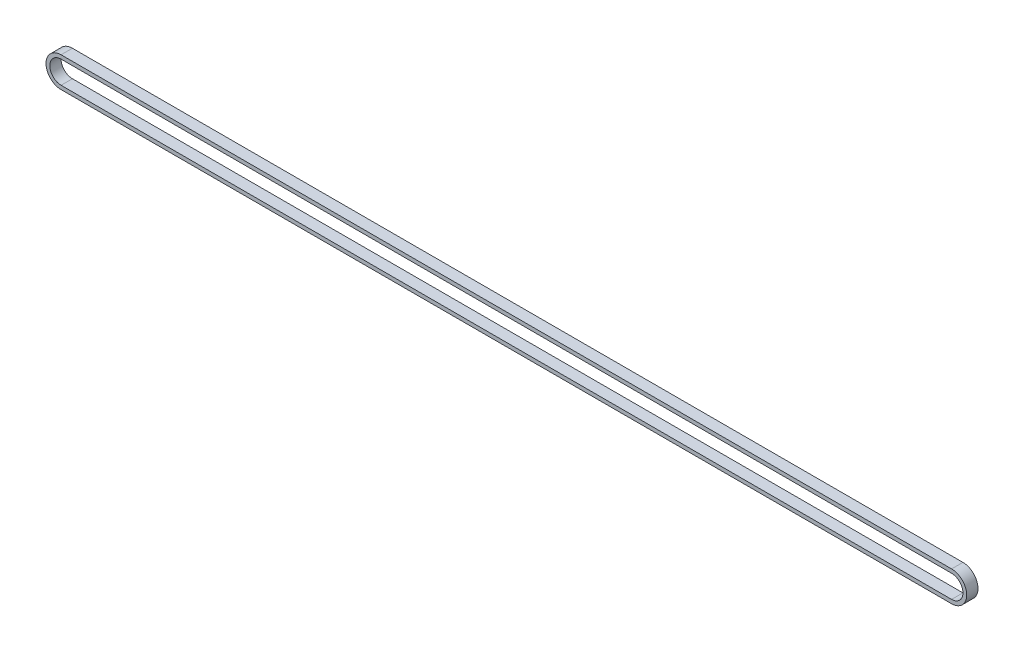
ISO-10303-21;
HEADER;
FILE_DESCRIPTION(('STEP AP214'),'2;1');
FILE_NAME('part.step','',(''),(''),'','','');
FILE_SCHEMA(('AUTOMOTIVE_DESIGN { 1 0 10303 214 1 1 1 1 }'));
ENDSEC;
DATA;
#1=APPLICATION_CONTEXT('core data for automotive mechanical design processes');
#2=APPLICATION_PROTOCOL_DEFINITION('international standard','automotive_design',2000,#1);
#3=PRODUCT_CONTEXT('',#1,'mechanical');
#4=PRODUCT('Part','Part','',(#3));
#5=PRODUCT_RELATED_PRODUCT_CATEGORY('part','',(#4));
#6=PRODUCT_DEFINITION_FORMATION('','',#4);
#7=PRODUCT_DEFINITION_CONTEXT('part definition',#1,'design');
#8=PRODUCT_DEFINITION('design','',#6,#7);
#9=PRODUCT_DEFINITION_SHAPE('','',#8);
#10=(LENGTH_UNIT() NAMED_UNIT(*) SI_UNIT(.MILLI.,.METRE.));
#11=(NAMED_UNIT(*) PLANE_ANGLE_UNIT() SI_UNIT($,.RADIAN.));
#12=(NAMED_UNIT(*) SI_UNIT($,.STERADIAN.) SOLID_ANGLE_UNIT());
#13=UNCERTAINTY_MEASURE_WITH_UNIT(LENGTH_MEASURE(1.E-05),#10,'distance_accuracy_value','');
#14=(GEOMETRIC_REPRESENTATION_CONTEXT(3) GLOBAL_UNCERTAINTY_ASSIGNED_CONTEXT((#13)) GLOBAL_UNIT_ASSIGNED_CONTEXT((#10,
#11,#12)) REPRESENTATION_CONTEXT('',''));
#15=CARTESIAN_POINT('',(0.,0.,0.));
#16=DIRECTION('',(0.,0.,1.));
#17=DIRECTION('',(1.,0.,0.));
#18=AXIS2_PLACEMENT_3D('',#15,#16,#17);
#19=CARTESIAN_POINT('',(236.,0.,6.));
#20=DIRECTION('',(0.,0.,-1.));
#21=DIRECTION('',(-1.,0.,0.));
#22=AXIS2_PLACEMENT_3D('',#19,#20,#21);
#23=PLANE('',#22);
#24=CARTESIAN_POINT('',(236.,0.,6.));
#25=DIRECTION('',(0.,0.,1.));
#26=DIRECTION('',(-1.,0.,0.));
#27=AXIS2_PLACEMENT_3D('',#24,#25,#26);
#28=CIRCLE('',#27,8.);
#29=CARTESIAN_POINT('',(236.,-8.00000000000006,6.));
#30=VERTEX_POINT('',#29);
#31=CARTESIAN_POINT('',(236.,7.99999999999994,6.));
#32=VERTEX_POINT('',#31);
#33=EDGE_CURVE('E136',#30,#32,#28,.T.);
#34=ORIENTED_EDGE('',*,*,#33,.T.);
#35=DIRECTION('',(-1.,0.,0.));
#36=VECTOR('',#35,1.);
#37=CARTESIAN_POINT('',(236.,7.99999999999994,6.));
#38=LINE('',#37,#36);
#39=CARTESIAN_POINT('',(-236.,7.99999999999994,6.));
#40=VERTEX_POINT('',#39);
#41=EDGE_CURVE('E139',#32,#40,#38,.T.);
#42=ORIENTED_EDGE('',*,*,#41,.T.);
#43=CARTESIAN_POINT('',(-236.,0.,6.));
#44=DIRECTION('',(0.,0.,1.));
#45=DIRECTION('',(1.,0.,0.));
#46=AXIS2_PLACEMENT_3D('',#43,#44,#45);
#47=CIRCLE('',#46,8.);
#48=CARTESIAN_POINT('',(-236.,-8.,6.));
#49=VERTEX_POINT('',#48);
#50=EDGE_CURVE('E142',#40,#49,#47,.T.);
#51=ORIENTED_EDGE('',*,*,#50,.T.);
#52=DIRECTION('',(1.,0.,0.));
#53=VECTOR('',#52,1.);
#54=CARTESIAN_POINT('',(236.,-8.00000000000006,6.));
#55=LINE('',#54,#53);
#56=EDGE_CURVE('E144',#49,#30,#55,.T.);
#57=ORIENTED_EDGE('',*,*,#56,.T.);
#58=EDGE_LOOP('',(#34,#42,#51,#57));
#59=FACE_BOUND('',#58,.T.);
#60=CARTESIAN_POINT('',(-236.,0.,6.));
#61=DIRECTION('',(0.,0.,1.));
#62=DIRECTION('',(1.,0.,0.));
#63=AXIS2_PLACEMENT_3D('',#60,#61,#62);
#64=CIRCLE('',#63,6.);
#65=CARTESIAN_POINT('',(-236.,6.,6.));
#66=VERTEX_POINT('',#65);
#67=CARTESIAN_POINT('',(-236.,-6.,6.));
#68=VERTEX_POINT('',#67);
#69=EDGE_CURVE('E100',#66,#68,#64,.T.);
#70=ORIENTED_EDGE('',*,*,#69,.F.);
#71=DIRECTION('',(-1.,0.,0.));
#72=VECTOR('',#71,1.);
#73=CARTESIAN_POINT('',(-236.,6.,6.));
#74=LINE('',#73,#72);
#75=CARTESIAN_POINT('',(236.,6.,6.));
#76=VERTEX_POINT('',#75);
#77=EDGE_CURVE('E122',#76,#66,#74,.T.);
#78=ORIENTED_EDGE('',*,*,#77,.F.);
#79=CARTESIAN_POINT('',(236.,0.,6.));
#80=DIRECTION('',(0.,0.,1.));
#81=DIRECTION('',(-1.,0.,0.));
#82=AXIS2_PLACEMENT_3D('',#79,#80,#81);
#83=CIRCLE('',#82,6.);
#84=CARTESIAN_POINT('',(236.,-6.,6.));
#85=VERTEX_POINT('',#84);
#86=EDGE_CURVE('E120',#85,#76,#83,.T.);
#87=ORIENTED_EDGE('',*,*,#86,.F.);
#88=DIRECTION('',(1.,0.,0.));
#89=VECTOR('',#88,1.);
#90=CARTESIAN_POINT('',(-236.,-6.,6.));
#91=LINE('',#90,#89);
#92=EDGE_CURVE('E108',#68,#85,#91,.T.);
#93=ORIENTED_EDGE('',*,*,#92,.F.);
#94=EDGE_LOOP('',(#70,#78,#87,#93));
#95=FACE_BOUND('',#94,.T.);
#96=ADVANCED_FACE('F35',(#59,#95),#23,.F.);
#97=CARTESIAN_POINT('',(236.,0.,0.));
#98=DIRECTION('',(0.,0.,-1.));
#99=DIRECTION('',(-1.,0.,0.));
#100=AXIS2_PLACEMENT_3D('',#97,#98,#99);
#101=PLANE('',#100);
#102=CARTESIAN_POINT('',(236.,0.,0.));
#103=DIRECTION('',(0.,0.,1.));
#104=DIRECTION('',(-1.,0.,0.));
#105=AXIS2_PLACEMENT_3D('',#102,#103,#104);
#106=CIRCLE('',#105,8.);
#107=CARTESIAN_POINT('',(236.,-8.00000000000006,0.));
#108=VERTEX_POINT('',#107);
#109=CARTESIAN_POINT('',(236.,7.99999999999994,0.));
#110=VERTEX_POINT('',#109);
#111=EDGE_CURVE('E116',#108,#110,#106,.T.);
#112=ORIENTED_EDGE('',*,*,#111,.F.);
#113=DIRECTION('',(1.,0.,0.));
#114=VECTOR('',#113,1.);
#115=CARTESIAN_POINT('',(236.,-8.00000000000006,0.));
#116=LINE('',#115,#114);
#117=CARTESIAN_POINT('',(-236.,-8.,0.));
#118=VERTEX_POINT('',#117);
#119=EDGE_CURVE('E140',#118,#108,#116,.T.);
#120=ORIENTED_EDGE('',*,*,#119,.F.);
#121=CARTESIAN_POINT('',(-236.,0.,0.));
#122=DIRECTION('',(0.,0.,1.));
#123=DIRECTION('',(1.,0.,0.));
#124=AXIS2_PLACEMENT_3D('',#121,#122,#123);
#125=CIRCLE('',#124,8.);
#126=CARTESIAN_POINT('',(-236.,7.99999999999994,0.));
#127=VERTEX_POINT('',#126);
#128=EDGE_CURVE('E151',#127,#118,#125,.T.);
#129=ORIENTED_EDGE('',*,*,#128,.F.);
#130=DIRECTION('',(-1.,0.,0.));
#131=VECTOR('',#130,1.);
#132=CARTESIAN_POINT('',(236.,7.99999999999994,0.));
#133=LINE('',#132,#131);
#134=EDGE_CURVE('E149',#110,#127,#133,.T.);
#135=ORIENTED_EDGE('',*,*,#134,.F.);
#136=EDGE_LOOP('',(#112,#120,#129,#135));
#137=FACE_BOUND('',#136,.T.);
#138=DIRECTION('',(-1.,0.,0.));
#139=VECTOR('',#138,1.);
#140=CARTESIAN_POINT('',(-236.,6.,0.));
#141=LINE('',#140,#139);
#142=CARTESIAN_POINT('',(236.,6.,0.));
#143=VERTEX_POINT('',#142);
#144=CARTESIAN_POINT('',(-236.,6.,0.));
#145=VERTEX_POINT('',#144);
#146=EDGE_CURVE('E109',#143,#145,#141,.T.);
#147=ORIENTED_EDGE('',*,*,#146,.T.);
#148=CARTESIAN_POINT('',(-236.,0.,0.));
#149=DIRECTION('',(0.,0.,1.));
#150=DIRECTION('',(1.,0.,0.));
#151=AXIS2_PLACEMENT_3D('',#148,#149,#150);
#152=CIRCLE('',#151,6.);
#153=CARTESIAN_POINT('',(-236.,-6.,0.));
#154=VERTEX_POINT('',#153);
#155=EDGE_CURVE('E58',#145,#154,#152,.T.);
#156=ORIENTED_EDGE('',*,*,#155,.T.);
#157=DIRECTION('',(1.,0.,0.));
#158=VECTOR('',#157,1.);
#159=CARTESIAN_POINT('',(-236.,-6.,0.));
#160=LINE('',#159,#158);
#161=CARTESIAN_POINT('',(236.,-6.,0.));
#162=VERTEX_POINT('',#161);
#163=EDGE_CURVE('E115',#154,#162,#160,.T.);
#164=ORIENTED_EDGE('',*,*,#163,.T.);
#165=CARTESIAN_POINT('',(236.,0.,0.));
#166=DIRECTION('',(0.,0.,1.));
#167=DIRECTION('',(-1.,0.,0.));
#168=AXIS2_PLACEMENT_3D('',#165,#166,#167);
#169=CIRCLE('',#168,6.);
#170=EDGE_CURVE('E128',#162,#143,#169,.T.);
#171=ORIENTED_EDGE('',*,*,#170,.T.);
#172=EDGE_LOOP('',(#147,#156,#164,#171));
#173=FACE_BOUND('',#172,.T.);
#174=ADVANCED_FACE('F169',(#137,#173),#101,.T.);
#175=CARTESIAN_POINT('',(236.,0.,6.));
#176=DIRECTION('',(0.,0.,-1.));
#177=DIRECTION('',(-1.,0.,0.));
#178=AXIS2_PLACEMENT_3D('',#175,#176,#177);
#179=CYLINDRICAL_SURFACE('',#178,8.);
#180=ORIENTED_EDGE('',*,*,#111,.T.);
#181=DIRECTION('',(0.,0.,-1.));
#182=VECTOR('',#181,1.);
#183=CARTESIAN_POINT('',(236.,7.99999999999994,6.));
#184=LINE('',#183,#182);
#185=EDGE_CURVE('E11',#32,#110,#184,.T.);
#186=ORIENTED_EDGE('',*,*,#185,.F.);
#187=ORIENTED_EDGE('',*,*,#33,.F.);
#188=DIRECTION('',(0.,0.,-1.));
#189=VECTOR('',#188,1.);
#190=CARTESIAN_POINT('',(236.,-8.00000000000006,6.));
#191=LINE('',#190,#189);
#192=EDGE_CURVE('E146',#30,#108,#191,.T.);
#193=ORIENTED_EDGE('',*,*,#192,.T.);
#194=EDGE_LOOP('',(#180,#186,#187,#193));
#195=FACE_BOUND('',#194,.T.);
#196=ADVANCED_FACE('F37',(#195),#179,.T.);
#197=CARTESIAN_POINT('',(236.,7.99999999999994,6.));
#198=DIRECTION('',(0.,-1.,0.));
#199=DIRECTION('',(0.,0.,-1.));
#200=AXIS2_PLACEMENT_3D('',#197,#198,#199);
#201=PLANE('',#200);
#202=ORIENTED_EDGE('',*,*,#134,.T.);
#203=DIRECTION('',(0.,0.,-1.));
#204=VECTOR('',#203,1.);
#205=CARTESIAN_POINT('',(-236.,7.99999999999994,6.));
#206=LINE('',#205,#204);
#207=EDGE_CURVE('E43',#40,#127,#206,.T.);
#208=ORIENTED_EDGE('',*,*,#207,.F.);
#209=ORIENTED_EDGE('',*,*,#41,.F.);
#210=ORIENTED_EDGE('',*,*,#185,.T.);
#211=EDGE_LOOP('',(#202,#208,#209,#210));
#212=FACE_BOUND('',#211,.T.);
#213=ADVANCED_FACE('F179',(#212),#201,.F.);
#214=CARTESIAN_POINT('',(-236.,0.,6.));
#215=DIRECTION('',(0.,0.,-1.));
#216=DIRECTION('',(-1.,0.,0.));
#217=AXIS2_PLACEMENT_3D('',#214,#215,#216);
#218=CYLINDRICAL_SURFACE('',#217,8.);
#219=ORIENTED_EDGE('',*,*,#128,.T.);
#220=DIRECTION('',(0.,0.,-1.));
#221=VECTOR('',#220,1.);
#222=CARTESIAN_POINT('',(-236.,-8.,6.));
#223=LINE('',#222,#221);
#224=EDGE_CURVE('E156',#49,#118,#223,.T.);
#225=ORIENTED_EDGE('',*,*,#224,.F.);
#226=ORIENTED_EDGE('',*,*,#50,.F.);
#227=ORIENTED_EDGE('',*,*,#207,.T.);
#228=EDGE_LOOP('',(#219,#225,#226,#227));
#229=FACE_BOUND('',#228,.T.);
#230=ADVANCED_FACE('F163',(#229),#218,.T.);
#231=CARTESIAN_POINT('',(236.,-8.00000000000006,6.));
#232=DIRECTION('',(0.,1.,0.));
#233=DIRECTION('',(0.,0.,1.));
#234=AXIS2_PLACEMENT_3D('',#231,#232,#233);
#235=PLANE('',#234);
#236=ORIENTED_EDGE('',*,*,#119,.T.);
#237=ORIENTED_EDGE('',*,*,#192,.F.);
#238=ORIENTED_EDGE('',*,*,#56,.F.);
#239=ORIENTED_EDGE('',*,*,#224,.T.);
#240=EDGE_LOOP('',(#236,#237,#238,#239));
#241=FACE_BOUND('',#240,.T.);
#242=ADVANCED_FACE('F173',(#241),#235,.F.);
#243=CARTESIAN_POINT('',(-236.,0.,6.));
#244=DIRECTION('',(0.,0.,-1.));
#245=DIRECTION('',(-1.,0.,0.));
#246=AXIS2_PLACEMENT_3D('',#243,#244,#245);
#247=CYLINDRICAL_SURFACE('',#246,6.);
#248=ORIENTED_EDGE('',*,*,#155,.F.);
#249=DIRECTION('',(0.,0.,-1.));
#250=VECTOR('',#249,1.);
#251=CARTESIAN_POINT('',(-236.,6.,6.));
#252=LINE('',#251,#250);
#253=EDGE_CURVE('E104',#66,#145,#252,.T.);
#254=ORIENTED_EDGE('',*,*,#253,.F.);
#255=ORIENTED_EDGE('',*,*,#69,.T.);
#256=DIRECTION('',(0.,0.,-1.));
#257=VECTOR('',#256,1.);
#258=CARTESIAN_POINT('',(-236.,-6.,6.));
#259=LINE('',#258,#257);
#260=EDGE_CURVE('E103',#68,#154,#259,.T.);
#261=ORIENTED_EDGE('',*,*,#260,.T.);
#262=EDGE_LOOP('',(#248,#254,#255,#261));
#263=FACE_BOUND('',#262,.T.);
#264=ADVANCED_FACE('F102',(#263),#247,.F.);
#265=CARTESIAN_POINT('',(-236.,-6.,6.));
#266=DIRECTION('',(0.,1.,0.));
#267=DIRECTION('',(0.,0.,1.));
#268=AXIS2_PLACEMENT_3D('',#265,#266,#267);
#269=PLANE('',#268);
#270=ORIENTED_EDGE('',*,*,#163,.F.);
#271=ORIENTED_EDGE('',*,*,#260,.F.);
#272=ORIENTED_EDGE('',*,*,#92,.T.);
#273=DIRECTION('',(0.,0.,-1.));
#274=VECTOR('',#273,1.);
#275=CARTESIAN_POINT('',(236.,-6.,6.));
#276=LINE('',#275,#274);
#277=EDGE_CURVE('E117',#85,#162,#276,.T.);
#278=ORIENTED_EDGE('',*,*,#277,.T.);
#279=EDGE_LOOP('',(#270,#271,#272,#278));
#280=FACE_BOUND('',#279,.T.);
#281=ADVANCED_FACE('F112',(#280),#269,.T.);
#282=CARTESIAN_POINT('',(236.,0.,6.));
#283=DIRECTION('',(0.,0.,-1.));
#284=DIRECTION('',(-1.,0.,0.));
#285=AXIS2_PLACEMENT_3D('',#282,#283,#284);
#286=CYLINDRICAL_SURFACE('',#285,6.);
#287=ORIENTED_EDGE('',*,*,#170,.F.);
#288=ORIENTED_EDGE('',*,*,#277,.F.);
#289=ORIENTED_EDGE('',*,*,#86,.T.);
#290=DIRECTION('',(0.,0.,-1.));
#291=VECTOR('',#290,1.);
#292=CARTESIAN_POINT('',(236.,6.,6.));
#293=LINE('',#292,#291);
#294=EDGE_CURVE('E50',#76,#143,#293,.T.);
#295=ORIENTED_EDGE('',*,*,#294,.T.);
#296=EDGE_LOOP('',(#287,#288,#289,#295));
#297=FACE_BOUND('',#296,.T.);
#298=ADVANCED_FACE('F202',(#297),#286,.F.);
#299=CARTESIAN_POINT('',(-236.,6.,6.));
#300=DIRECTION('',(0.,-1.,0.));
#301=DIRECTION('',(0.,0.,-1.));
#302=AXIS2_PLACEMENT_3D('',#299,#300,#301);
#303=PLANE('',#302);
#304=ORIENTED_EDGE('',*,*,#146,.F.);
#305=ORIENTED_EDGE('',*,*,#294,.F.);
#306=ORIENTED_EDGE('',*,*,#77,.T.);
#307=ORIENTED_EDGE('',*,*,#253,.T.);
#308=EDGE_LOOP('',(#304,#305,#306,#307));
#309=FACE_BOUND('',#308,.T.);
#310=ADVANCED_FACE('F206',(#309),#303,.T.);
#311=CLOSED_SHELL('',(#96,#174,#196,#213,#230,#242,#264,#281,#298,#310));
#312=MANIFOLD_SOLID_BREP('B2',#311);
#313=ADVANCED_BREP_SHAPE_REPRESENTATION('',(#18,#312),#14);
#314=SHAPE_DEFINITION_REPRESENTATION(#9,#313);
ENDSEC;
END-ISO-10303-21;
